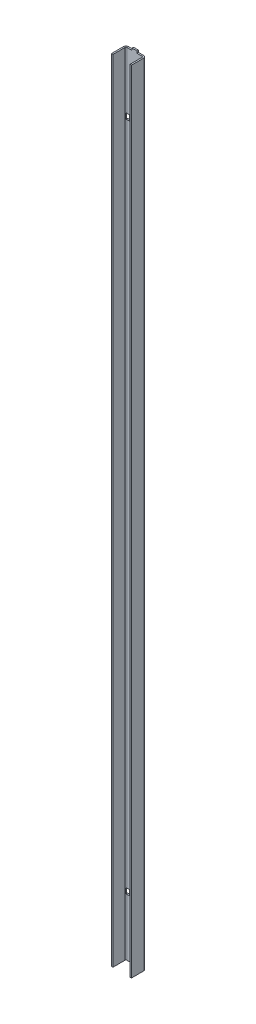
ISO-10303-21;
HEADER;
FILE_DESCRIPTION(('STEP AP214'),'2;1');
FILE_NAME('part.step','',(''),(''),'','','');
FILE_SCHEMA(('AUTOMOTIVE_DESIGN { 1 0 10303 214 1 1 1 1 }'));
ENDSEC;
DATA;
#1=APPLICATION_CONTEXT('core data for automotive mechanical design processes');
#2=APPLICATION_PROTOCOL_DEFINITION('international standard','automotive_design',2000,#1);
#3=PRODUCT_CONTEXT('',#1,'mechanical');
#4=PRODUCT('Part','Part','',(#3));
#5=PRODUCT_RELATED_PRODUCT_CATEGORY('part','',(#4));
#6=PRODUCT_DEFINITION_FORMATION('','',#4);
#7=PRODUCT_DEFINITION_CONTEXT('part definition',#1,'design');
#8=PRODUCT_DEFINITION('design','',#6,#7);
#9=PRODUCT_DEFINITION_SHAPE('','',#8);
#10=(LENGTH_UNIT() NAMED_UNIT(*) SI_UNIT(.MILLI.,.METRE.));
#11=(NAMED_UNIT(*) PLANE_ANGLE_UNIT() SI_UNIT($,.RADIAN.));
#12=(NAMED_UNIT(*) SI_UNIT($,.STERADIAN.) SOLID_ANGLE_UNIT());
#13=UNCERTAINTY_MEASURE_WITH_UNIT(LENGTH_MEASURE(1.E-05),#10,'distance_accuracy_value','');
#14=(GEOMETRIC_REPRESENTATION_CONTEXT(3) GLOBAL_UNCERTAINTY_ASSIGNED_CONTEXT((#13)) GLOBAL_UNIT_ASSIGNED_CONTEXT((#10,
#11,#12)) REPRESENTATION_CONTEXT('',''));
#15=CARTESIAN_POINT('',(0.,0.,0.));
#16=DIRECTION('',(0.,0.,1.));
#17=DIRECTION('',(1.,0.,0.));
#18=AXIS2_PLACEMENT_3D('',#15,#16,#17);
#19=CARTESIAN_POINT('',(1783.18296268255,394.,0.));
#20=DIRECTION('',(0.,0.,1.));
#21=DIRECTION('',(1.,0.,0.));
#22=AXIS2_PLACEMENT_3D('',#19,#20,#21);
#23=PLANE('',#22);
#24=DIRECTION('',(0.,1.,0.));
#25=VECTOR('',#24,1.);
#26=CARTESIAN_POINT('',(207.5,394.,0.));
#27=LINE('',#26,#25);
#28=CARTESIAN_POINT('',(207.5,-393.5,0.));
#29=VERTEX_POINT('',#28);
#30=CARTESIAN_POINT('',(207.5,393.5,0.));
#31=VERTEX_POINT('',#30);
#32=EDGE_CURVE('E114',#29,#31,#27,.T.);
#33=ORIENTED_EDGE('',*,*,#32,.F.);
#34=DIRECTION('',(-1.,0.,0.));
#35=VECTOR('',#34,1.);
#36=CARTESIAN_POINT('',(1783.18296268255,-393.5,0.));
#37=LINE('',#36,#35);
#38=CARTESIAN_POINT('',(209.,-393.5,0.));
#39=VERTEX_POINT('',#38);
#40=EDGE_CURVE('E625',#39,#29,#37,.T.);
#41=ORIENTED_EDGE('',*,*,#40,.F.);
#42=DIRECTION('',(0.,1.,0.));
#43=VECTOR('',#42,1.);
#44=CARTESIAN_POINT('',(209.,394.,0.));
#45=LINE('',#44,#43);
#46=CARTESIAN_POINT('',(209.,393.5,0.));
#47=VERTEX_POINT('',#46);
#48=EDGE_CURVE('E90',#39,#47,#45,.T.);
#49=ORIENTED_EDGE('',*,*,#48,.T.);
#50=DIRECTION('',(-1.,0.,0.));
#51=VECTOR('',#50,1.);
#52=CARTESIAN_POINT('',(1783.18296268255,393.5,0.));
#53=LINE('',#52,#51);
#54=EDGE_CURVE('E107',#47,#31,#53,.T.);
#55=ORIENTED_EDGE('',*,*,#54,.T.);
#56=EDGE_LOOP('',(#33,#41,#49,#55));
#57=FACE_BOUND('',#56,.T.);
#58=ADVANCED_FACE('F65',(#57),#23,.T.);
#59=CARTESIAN_POINT('',(1783.18296268255,393.5,-12.));
#60=DIRECTION('',(0.,-1.,0.));
#61=DIRECTION('',(-1.,0.,0.));
#62=AXIS2_PLACEMENT_3D('',#59,#60,#61);
#63=PLANE('',#62);
#64=DIRECTION('',(-1.,0.,0.));
#65=VECTOR('',#64,1.);
#66=CARTESIAN_POINT('',(1783.18296268255,393.5,-12.));
#67=LINE('',#66,#65);
#68=CARTESIAN_POINT('',(209.,393.5,-12.));
#69=VERTEX_POINT('',#68);
#70=CARTESIAN_POINT('',(207.5,393.5,-12.));
#71=VERTEX_POINT('',#70);
#72=EDGE_CURVE('E598',#69,#71,#67,.T.);
#73=ORIENTED_EDGE('',*,*,#72,.T.);
#74=DIRECTION('',(0.,0.,-1.));
#75=VECTOR('',#74,1.);
#76=CARTESIAN_POINT('',(207.5,393.5,-12.));
#77=LINE('',#76,#75);
#78=EDGE_CURVE('E600',#31,#71,#77,.T.);
#79=ORIENTED_EDGE('',*,*,#78,.F.);
#80=ORIENTED_EDGE('',*,*,#54,.F.);
#81=DIRECTION('',(0.,0.,-1.));
#82=VECTOR('',#81,1.);
#83=CARTESIAN_POINT('',(209.,393.5,-12.));
#84=LINE('',#83,#82);
#85=EDGE_CURVE('E13',#69,#47,#84,.F.);
#86=ORIENTED_EDGE('',*,*,#85,.F.);
#87=EDGE_LOOP('',(#73,#79,#80,#86));
#88=FACE_BOUND('',#87,.T.);
#89=ADVANCED_FACE('F597',(#88),#63,.F.);
#90=CARTESIAN_POINT('',(207.5,394.,-14.5));
#91=DIRECTION('',(1.,0.,0.));
#92=DIRECTION('',(0.,0.,1.));
#93=AXIS2_PLACEMENT_3D('',#90,#91,#92);
#94=PLANE('',#93);
#95=DIRECTION('',(0.,0.,1.));
#96=VECTOR('',#95,1.);
#97=CARTESIAN_POINT('',(207.5,-393.5,-12.));
#98=LINE('',#97,#96);
#99=CARTESIAN_POINT('',(207.5,-393.5,-12.));
#100=VERTEX_POINT('',#99);
#101=EDGE_CURVE('E605',#100,#29,#98,.T.);
#102=ORIENTED_EDGE('',*,*,#101,.T.);
#103=ORIENTED_EDGE('',*,*,#32,.T.);
#104=ORIENTED_EDGE('',*,*,#78,.T.);
#105=DIRECTION('',(0.,-1.,0.));
#106=VECTOR('',#105,1.);
#107=CARTESIAN_POINT('',(207.5,394.,-12.));
#108=LINE('',#107,#106);
#109=EDGE_CURVE('E619',#71,#100,#108,.T.);
#110=ORIENTED_EDGE('',*,*,#109,.T.);
#111=EDGE_LOOP('',(#102,#103,#104,#110));
#112=FACE_BOUND('',#111,.T.);
#113=ADVANCED_FACE('F621',(#112),#94,.F.);
#114=CARTESIAN_POINT('',(1783.18296268255,-393.5,-12.));
#115=DIRECTION('',(0.,1.,0.));
#116=DIRECTION('',(1.,0.,0.));
#117=AXIS2_PLACEMENT_3D('',#114,#115,#116);
#118=PLANE('',#117);
#119=ORIENTED_EDGE('',*,*,#40,.T.);
#120=ORIENTED_EDGE('',*,*,#101,.F.);
#121=DIRECTION('',(-1.,0.,0.));
#122=VECTOR('',#121,1.);
#123=CARTESIAN_POINT('',(1783.18296268255,-393.5,-12.));
#124=LINE('',#123,#122);
#125=CARTESIAN_POINT('',(209.,-393.5,-12.));
#126=VERTEX_POINT('',#125);
#127=EDGE_CURVE('E593',#126,#100,#124,.T.);
#128=ORIENTED_EDGE('',*,*,#127,.F.);
#129=DIRECTION('',(0.,0.,1.));
#130=VECTOR('',#129,1.);
#131=CARTESIAN_POINT('',(209.,-393.5,-12.));
#132=LINE('',#131,#130);
#133=EDGE_CURVE('E78',#39,#126,#132,.F.);
#134=ORIENTED_EDGE('',*,*,#133,.F.);
#135=EDGE_LOOP('',(#119,#120,#128,#134));
#136=FACE_BOUND('',#135,.T.);
#137=ADVANCED_FACE('F626',(#136),#118,.F.);
#138=CARTESIAN_POINT('',(209.,394.,-14.5));
#139=DIRECTION('',(1.,0.,0.));
#140=DIRECTION('',(0.,0.,1.));
#141=AXIS2_PLACEMENT_3D('',#138,#139,#140);
#142=PLANE('',#141);
#143=ORIENTED_EDGE('',*,*,#133,.T.);
#144=DIRECTION('',(0.,-1.,0.));
#145=VECTOR('',#144,1.);
#146=CARTESIAN_POINT('',(209.,394.,-12.));
#147=LINE('',#146,#145);
#148=EDGE_CURVE('E70',#69,#126,#147,.T.);
#149=ORIENTED_EDGE('',*,*,#148,.F.);
#150=ORIENTED_EDGE('',*,*,#85,.T.);
#151=ORIENTED_EDGE('',*,*,#48,.F.);
#152=EDGE_LOOP('',(#143,#149,#150,#151));
#153=FACE_BOUND('',#152,.T.);
#154=ADVANCED_FACE('F68',(#153),#142,.T.);
#155=CARTESIAN_POINT('',(-1348.18296268255,394.,0.));
#156=DIRECTION('',(0.,0.,1.));
#157=DIRECTION('',(1.,0.,0.));
#158=AXIS2_PLACEMENT_3D('',#155,#156,#157);
#159=PLANE('',#158);
#160=DIRECTION('',(0.,1.,0.));
#161=VECTOR('',#160,1.);
#162=CARTESIAN_POINT('',(227.5,394.,0.));
#163=LINE('',#162,#161);
#164=CARTESIAN_POINT('',(227.5,393.5,0.));
#165=VERTEX_POINT('',#164);
#166=CARTESIAN_POINT('',(227.5,-393.5,0.));
#167=VERTEX_POINT('',#166);
#168=EDGE_CURVE('E151',#165,#167,#163,.F.);
#169=ORIENTED_EDGE('',*,*,#168,.F.);
#170=DIRECTION('',(1.,0.,0.));
#171=VECTOR('',#170,1.);
#172=CARTESIAN_POINT('',(-1348.18296268255,393.5,0.));
#173=LINE('',#172,#171);
#174=CARTESIAN_POINT('',(226.,393.5,0.));
#175=VERTEX_POINT('',#174);
#176=EDGE_CURVE('E673',#175,#165,#173,.T.);
#177=ORIENTED_EDGE('',*,*,#176,.F.);
#178=DIRECTION('',(0.,1.,0.));
#179=VECTOR('',#178,1.);
#180=CARTESIAN_POINT('',(226.,394.,0.));
#181=LINE('',#180,#179);
#182=CARTESIAN_POINT('',(226.,-393.5,0.));
#183=VERTEX_POINT('',#182);
#184=EDGE_CURVE('E126',#175,#183,#181,.F.);
#185=ORIENTED_EDGE('',*,*,#184,.T.);
#186=DIRECTION('',(1.,0.,0.));
#187=VECTOR('',#186,1.);
#188=CARTESIAN_POINT('',(-1348.18296268255,-393.5,0.));
#189=LINE('',#188,#187);
#190=EDGE_CURVE('E655',#183,#167,#189,.T.);
#191=ORIENTED_EDGE('',*,*,#190,.T.);
#192=EDGE_LOOP('',(#169,#177,#185,#191));
#193=FACE_BOUND('',#192,.T.);
#194=ADVANCED_FACE('F942',(#193),#159,.T.);
#195=CARTESIAN_POINT('',(-1348.18296268255,-393.5,-12.));
#196=DIRECTION('',(0.,1.,0.));
#197=DIRECTION('',(-1.,0.,0.));
#198=AXIS2_PLACEMENT_3D('',#195,#196,#197);
#199=PLANE('',#198);
#200=DIRECTION('',(1.,0.,0.));
#201=VECTOR('',#200,1.);
#202=CARTESIAN_POINT('',(-1348.18296268255,-393.5,-12.));
#203=LINE('',#202,#201);
#204=CARTESIAN_POINT('',(226.,-393.5,-12.));
#205=VERTEX_POINT('',#204);
#206=CARTESIAN_POINT('',(227.5,-393.5,-12.));
#207=VERTEX_POINT('',#206);
#208=EDGE_CURVE('E658',#205,#207,#203,.T.);
#209=ORIENTED_EDGE('',*,*,#208,.T.);
#210=DIRECTION('',(0.,0.,1.));
#211=VECTOR('',#210,1.);
#212=CARTESIAN_POINT('',(227.5,-393.5,-12.));
#213=LINE('',#212,#211);
#214=EDGE_CURVE('E144',#167,#207,#213,.F.);
#215=ORIENTED_EDGE('',*,*,#214,.F.);
#216=ORIENTED_EDGE('',*,*,#190,.F.);
#217=DIRECTION('',(0.,0.,1.));
#218=VECTOR('',#217,1.);
#219=CARTESIAN_POINT('',(226.,-393.5,-12.));
#220=LINE('',#219,#218);
#221=EDGE_CURVE('E675',#205,#183,#220,.T.);
#222=ORIENTED_EDGE('',*,*,#221,.F.);
#223=EDGE_LOOP('',(#209,#215,#216,#222));
#224=FACE_BOUND('',#223,.T.);
#225=ADVANCED_FACE('F946',(#224),#199,.F.);
#226=CARTESIAN_POINT('',(227.5,394.,0.));
#227=DIRECTION('',(-1.,0.,0.));
#228=DIRECTION('',(0.,0.,-1.));
#229=AXIS2_PLACEMENT_3D('',#226,#227,#228);
#230=PLANE('',#229);
#231=ORIENTED_EDGE('',*,*,#214,.T.);
#232=DIRECTION('',(0.,-1.,0.));
#233=VECTOR('',#232,1.);
#234=CARTESIAN_POINT('',(227.5,394.,-12.));
#235=LINE('',#234,#233);
#236=CARTESIAN_POINT('',(227.5,393.5,-12.));
#237=VERTEX_POINT('',#236);
#238=EDGE_CURVE('E663',#207,#237,#235,.F.);
#239=ORIENTED_EDGE('',*,*,#238,.T.);
#240=DIRECTION('',(0.,0.,-1.));
#241=VECTOR('',#240,1.);
#242=CARTESIAN_POINT('',(227.5,393.5,-12.));
#243=LINE('',#242,#241);
#244=EDGE_CURVE('E667',#237,#165,#243,.F.);
#245=ORIENTED_EDGE('',*,*,#244,.T.);
#246=ORIENTED_EDGE('',*,*,#168,.T.);
#247=EDGE_LOOP('',(#231,#239,#245,#246));
#248=FACE_BOUND('',#247,.T.);
#249=ADVANCED_FACE('F951',(#248),#230,.F.);
#250=CARTESIAN_POINT('',(-1348.18296268255,393.5,-12.));
#251=DIRECTION('',(0.,-1.,0.));
#252=DIRECTION('',(1.,0.,0.));
#253=AXIS2_PLACEMENT_3D('',#250,#251,#252);
#254=PLANE('',#253);
#255=ORIENTED_EDGE('',*,*,#176,.T.);
#256=ORIENTED_EDGE('',*,*,#244,.F.);
#257=DIRECTION('',(1.,0.,0.));
#258=VECTOR('',#257,1.);
#259=CARTESIAN_POINT('',(-1348.18296268255,393.5,-12.));
#260=LINE('',#259,#258);
#261=CARTESIAN_POINT('',(226.,393.5,-12.));
#262=VERTEX_POINT('',#261);
#263=EDGE_CURVE('E648',#262,#237,#260,.T.);
#264=ORIENTED_EDGE('',*,*,#263,.F.);
#265=DIRECTION('',(0.,0.,-1.));
#266=VECTOR('',#265,1.);
#267=CARTESIAN_POINT('',(226.,393.5,-12.));
#268=LINE('',#267,#266);
#269=EDGE_CURVE('E594',#175,#262,#268,.T.);
#270=ORIENTED_EDGE('',*,*,#269,.F.);
#271=EDGE_LOOP('',(#255,#256,#264,#270));
#272=FACE_BOUND('',#271,.T.);
#273=ADVANCED_FACE('F958',(#272),#254,.F.);
#274=CARTESIAN_POINT('',(226.,394.,0.));
#275=DIRECTION('',(-1.,0.,0.));
#276=DIRECTION('',(0.,0.,-1.));
#277=AXIS2_PLACEMENT_3D('',#274,#275,#276);
#278=PLANE('',#277);
#279=ORIENTED_EDGE('',*,*,#221,.T.);
#280=ORIENTED_EDGE('',*,*,#184,.F.);
#281=ORIENTED_EDGE('',*,*,#269,.T.);
#282=DIRECTION('',(0.,-1.,0.));
#283=VECTOR('',#282,1.);
#284=CARTESIAN_POINT('',(226.,394.,-12.));
#285=LINE('',#284,#283);
#286=EDGE_CURVE('E645',#205,#262,#285,.F.);
#287=ORIENTED_EDGE('',*,*,#286,.F.);
#288=EDGE_LOOP('',(#279,#280,#281,#287));
#289=FACE_BOUND('',#288,.T.);
#290=ADVANCED_FACE('F933',(#289),#278,.T.);
#291=CARTESIAN_POINT('',(227.5,394.,-13.));
#292=DIRECTION('',(0.,0.,1.));
#293=DIRECTION('',(-1.,0.,0.));
#294=AXIS2_PLACEMENT_3D('',#291,#292,#293);
#295=PLANE('',#294);
#296=DIRECTION('',(0.,1.,0.));
#297=VECTOR('',#296,1.);
#298=CARTESIAN_POINT('',(210.,394.,-13.));
#299=LINE('',#298,#297);
#300=CARTESIAN_POINT('',(210.,-331.3,-13.));
#301=VERTEX_POINT('',#300);
#302=CARTESIAN_POINT('',(210.,331.3,-13.));
#303=VERTEX_POINT('',#302);
#304=EDGE_CURVE('E514',#301,#303,#299,.T.);
#305=ORIENTED_EDGE('',*,*,#304,.F.);
#306=DIRECTION('',(-1.,0.,0.));
#307=VECTOR('',#306,1.);
#308=CARTESIAN_POINT('',(227.5,-331.3,-13.));
#309=LINE('',#308,#307);
#310=CARTESIAN_POINT('',(212.5,-331.3,-13.));
#311=VERTEX_POINT('',#310);
#312=EDGE_CURVE('E519',#311,#301,#309,.T.);
#313=ORIENTED_EDGE('',*,*,#312,.F.);
#314=DIRECTION('',(0.,1.,0.));
#315=VECTOR('',#314,1.);
#316=CARTESIAN_POINT('',(212.5,394.,-13.));
#317=LINE('',#316,#315);
#318=CARTESIAN_POINT('',(212.5,-336.7,-13.));
#319=VERTEX_POINT('',#318);
#320=EDGE_CURVE('E872',#319,#311,#317,.T.);
#321=ORIENTED_EDGE('',*,*,#320,.F.);
#322=DIRECTION('',(1.,0.,0.));
#323=VECTOR('',#322,1.);
#324=CARTESIAN_POINT('',(227.5,-336.7,-13.));
#325=LINE('',#324,#323);
#326=CARTESIAN_POINT('',(210.,-336.7,-13.));
#327=VERTEX_POINT('',#326);
#328=EDGE_CURVE('E795',#327,#319,#325,.T.);
#329=ORIENTED_EDGE('',*,*,#328,.F.);
#330=CARTESIAN_POINT('',(210.,-393.5,-13.));
#331=VERTEX_POINT('',#330);
#332=EDGE_CURVE('E521',#331,#327,#299,.T.);
#333=ORIENTED_EDGE('',*,*,#332,.F.);
#334=DIRECTION('',(-1.,0.,0.));
#335=VECTOR('',#334,1.);
#336=CARTESIAN_POINT('',(227.5,-393.5,-13.));
#337=LINE('',#336,#335);
#338=CARTESIAN_POINT('',(215.,-393.5,-13.));
#339=VERTEX_POINT('',#338);
#340=EDGE_CURVE('E787',#339,#331,#337,.T.);
#341=ORIENTED_EDGE('',*,*,#340,.F.);
#342=DIRECTION('',(0.,-1.,0.));
#343=VECTOR('',#342,1.);
#344=CARTESIAN_POINT('',(215.,-393.5,-13.));
#345=LINE('',#344,#343);
#346=CARTESIAN_POINT('',(215.,-395.5,-13.));
#347=VERTEX_POINT('',#346);
#348=EDGE_CURVE('E793',#339,#347,#345,.T.);
#349=ORIENTED_EDGE('',*,*,#348,.T.);
#350=DIRECTION('',(1.,0.,0.));
#351=VECTOR('',#350,1.);
#352=CARTESIAN_POINT('',(215.,-395.5,-13.));
#353=LINE('',#352,#351);
#354=CARTESIAN_POINT('',(220.,-395.5,-13.));
#355=VERTEX_POINT('',#354);
#356=EDGE_CURVE('E804',#347,#355,#353,.T.);
#357=ORIENTED_EDGE('',*,*,#356,.T.);
#358=DIRECTION('',(0.,1.,0.));
#359=VECTOR('',#358,1.);
#360=CARTESIAN_POINT('',(220.,-393.5,-13.));
#361=LINE('',#360,#359);
#362=CARTESIAN_POINT('',(220.,-393.5,-13.));
#363=VERTEX_POINT('',#362);
#364=EDGE_CURVE('E807',#355,#363,#361,.T.);
#365=ORIENTED_EDGE('',*,*,#364,.T.);
#366=CARTESIAN_POINT('',(225.,-393.5,-13.));
#367=VERTEX_POINT('',#366);
#368=EDGE_CURVE('E794',#367,#363,#337,.T.);
#369=ORIENTED_EDGE('',*,*,#368,.F.);
#370=DIRECTION('',(0.,1.,0.));
#371=VECTOR('',#370,1.);
#372=CARTESIAN_POINT('',(225.,394.,-13.));
#373=LINE('',#372,#371);
#374=CARTESIAN_POINT('',(225.,393.5,-13.));
#375=VERTEX_POINT('',#374);
#376=EDGE_CURVE('E810',#375,#367,#373,.F.);
#377=ORIENTED_EDGE('',*,*,#376,.F.);
#378=DIRECTION('',(-1.,0.,0.));
#379=VECTOR('',#378,1.);
#380=CARTESIAN_POINT('',(227.5,393.5,-13.));
#381=LINE('',#380,#379);
#382=CARTESIAN_POINT('',(220.,393.5,-13.));
#383=VERTEX_POINT('',#382);
#384=EDGE_CURVE('E780',#383,#375,#381,.F.);
#385=ORIENTED_EDGE('',*,*,#384,.F.);
#386=DIRECTION('',(0.,1.,0.));
#387=VECTOR('',#386,1.);
#388=CARTESIAN_POINT('',(220.,393.5,-13.));
#389=LINE('',#388,#387);
#390=CARTESIAN_POINT('',(220.,395.5,-13.));
#391=VERTEX_POINT('',#390);
#392=EDGE_CURVE('E776',#383,#391,#389,.T.);
#393=ORIENTED_EDGE('',*,*,#392,.T.);
#394=DIRECTION('',(-1.,0.,0.));
#395=VECTOR('',#394,1.);
#396=CARTESIAN_POINT('',(220.,395.5,-13.));
#397=LINE('',#396,#395);
#398=CARTESIAN_POINT('',(215.,395.5,-13.));
#399=VERTEX_POINT('',#398);
#400=EDGE_CURVE('E772',#391,#399,#397,.T.);
#401=ORIENTED_EDGE('',*,*,#400,.T.);
#402=DIRECTION('',(0.,-1.,0.));
#403=VECTOR('',#402,1.);
#404=CARTESIAN_POINT('',(215.,393.5,-13.));
#405=LINE('',#404,#403);
#406=CARTESIAN_POINT('',(215.,393.5,-13.));
#407=VERTEX_POINT('',#406);
#408=EDGE_CURVE('E768',#399,#407,#405,.T.);
#409=ORIENTED_EDGE('',*,*,#408,.T.);
#410=CARTESIAN_POINT('',(210.,393.5,-13.));
#411=VERTEX_POINT('',#410);
#412=EDGE_CURVE('E771',#411,#407,#381,.F.);
#413=ORIENTED_EDGE('',*,*,#412,.F.);
#414=CARTESIAN_POINT('',(210.,336.7,-13.));
#415=VERTEX_POINT('',#414);
#416=EDGE_CURVE('E520',#415,#411,#299,.T.);
#417=ORIENTED_EDGE('',*,*,#416,.F.);
#418=DIRECTION('',(-1.,0.,0.));
#419=VECTOR('',#418,1.);
#420=CARTESIAN_POINT('',(227.5,336.7,-13.));
#421=LINE('',#420,#419);
#422=CARTESIAN_POINT('',(212.5,336.7,-13.));
#423=VERTEX_POINT('',#422);
#424=EDGE_CURVE('E760',#423,#415,#421,.T.);
#425=ORIENTED_EDGE('',*,*,#424,.F.);
#426=DIRECTION('',(0.,1.,0.));
#427=VECTOR('',#426,1.);
#428=CARTESIAN_POINT('',(212.5,394.,-13.));
#429=LINE('',#428,#427);
#430=CARTESIAN_POINT('',(212.5,331.3,-12.9999999999999));
#431=VERTEX_POINT('',#430);
#432=EDGE_CURVE('E755',#431,#423,#429,.T.);
#433=ORIENTED_EDGE('',*,*,#432,.F.);
#434=DIRECTION('',(1.,0.,0.));
#435=VECTOR('',#434,1.);
#436=CARTESIAN_POINT('',(227.5,331.3,-13.));
#437=LINE('',#436,#435);
#438=EDGE_CURVE('E750',#303,#431,#437,.T.);
#439=ORIENTED_EDGE('',*,*,#438,.F.);
#440=EDGE_LOOP('',(#305,#313,#321,#329,#333,#341,#349,#357,#365,#369,#377,#385,#393,#401,#409,
#413,#417,#425,#433,#439));
#441=FACE_BOUND('',#440,.T.);
#442=ADVANCED_FACE('F868',(#441),#295,.T.);
#443=CARTESIAN_POINT('',(227.5,-331.3,1569.28442449517));
#444=DIRECTION('',(0.,-1.,0.));
#445=DIRECTION('',(0.,0.,-1.));
#446=AXIS2_PLACEMENT_3D('',#443,#444,#445);
#447=PLANE('',#446);
#448=DIRECTION('',(-1.,0.,0.));
#449=VECTOR('',#448,1.);
#450=CARTESIAN_POINT('',(227.5,-331.3,-14.5));
#451=LINE('',#450,#449);
#452=CARTESIAN_POINT('',(212.5,-331.3,-14.5));
#453=VERTEX_POINT('',#452);
#454=CARTESIAN_POINT('',(210.,-331.3,-14.5));
#455=VERTEX_POINT('',#454);
#456=EDGE_CURVE('E162',#453,#455,#451,.T.);
#457=ORIENTED_EDGE('',*,*,#456,.F.);
#458=DIRECTION('',(0.,0.,-1.));
#459=VECTOR('',#458,1.);
#460=CARTESIAN_POINT('',(212.5,-331.3,1569.28442449517));
#461=LINE('',#460,#459);
#462=EDGE_CURVE('E684',#311,#453,#461,.T.);
#463=ORIENTED_EDGE('',*,*,#462,.F.);
#464=ORIENTED_EDGE('',*,*,#312,.T.);
#465=DIRECTION('',(0.,0.,-1.));
#466=VECTOR('',#465,1.);
#467=CARTESIAN_POINT('',(210.,-331.3,1569.28442449517));
#468=LINE('',#467,#466);
#469=EDGE_CURVE('E649',#301,#455,#468,.T.);
#470=ORIENTED_EDGE('',*,*,#469,.T.);
#471=EDGE_LOOP('',(#457,#463,#464,#470));
#472=FACE_BOUND('',#471,.T.);
#473=ADVANCED_FACE('F870',(#472),#447,.T.);
#474=CARTESIAN_POINT('',(212.5,394.,1569.28442449517));
#475=DIRECTION('',(-1.,0.,0.));
#476=DIRECTION('',(0.,0.,1.));
#477=AXIS2_PLACEMENT_3D('',#474,#475,#476);
#478=PLANE('',#477);
#479=DIRECTION('',(0.,1.,0.));
#480=VECTOR('',#479,1.);
#481=CARTESIAN_POINT('',(212.5,394.,-14.5));
#482=LINE('',#481,#480);
#483=CARTESIAN_POINT('',(212.5,-336.7,-14.5));
#484=VERTEX_POINT('',#483);
#485=EDGE_CURVE('E171',#484,#453,#482,.T.);
#486=ORIENTED_EDGE('',*,*,#485,.F.);
#487=DIRECTION('',(0.,0.,-1.));
#488=VECTOR('',#487,1.);
#489=CARTESIAN_POINT('',(212.5,-336.7,1569.28442449517));
#490=LINE('',#489,#488);
#491=EDGE_CURVE('E687',#319,#484,#490,.T.);
#492=ORIENTED_EDGE('',*,*,#491,.F.);
#493=ORIENTED_EDGE('',*,*,#320,.T.);
#494=ORIENTED_EDGE('',*,*,#462,.T.);
#495=EDGE_LOOP('',(#486,#492,#493,#494));
#496=FACE_BOUND('',#495,.T.);
#497=ADVANCED_FACE('F1226',(#496),#478,.T.);
#498=CARTESIAN_POINT('',(227.5,-336.7,1569.28442449517));
#499=DIRECTION('',(0.,1.,0.));
#500=DIRECTION('',(0.,0.,1.));
#501=AXIS2_PLACEMENT_3D('',#498,#499,#500);
#502=PLANE('',#501);
#503=DIRECTION('',(1.,0.,0.));
#504=VECTOR('',#503,1.);
#505=CARTESIAN_POINT('',(227.5,-336.7,-14.5));
#506=LINE('',#505,#504);
#507=CARTESIAN_POINT('',(210.,-336.7,-14.5));
#508=VERTEX_POINT('',#507);
#509=EDGE_CURVE('E501',#508,#484,#506,.T.);
#510=ORIENTED_EDGE('',*,*,#509,.F.);
#511=DIRECTION('',(0.,0.,-1.));
#512=VECTOR('',#511,1.);
#513=CARTESIAN_POINT('',(210.,-336.7,1569.28442449517));
#514=LINE('',#513,#512);
#515=EDGE_CURVE('E690',#327,#508,#514,.T.);
#516=ORIENTED_EDGE('',*,*,#515,.F.);
#517=ORIENTED_EDGE('',*,*,#328,.T.);
#518=ORIENTED_EDGE('',*,*,#491,.T.);
#519=EDGE_LOOP('',(#510,#516,#517,#518));
#520=FACE_BOUND('',#519,.T.);
#521=ADVANCED_FACE('F1234',(#520),#502,.T.);
#522=CARTESIAN_POINT('',(227.5,-393.5,1569.28442449517));
#523=DIRECTION('',(0.,-1.,0.));
#524=DIRECTION('',(0.,0.,-1.));
#525=AXIS2_PLACEMENT_3D('',#522,#523,#524);
#526=PLANE('',#525);
#527=DIRECTION('',(1.,0.,0.));
#528=VECTOR('',#527,1.);
#529=CARTESIAN_POINT('',(226.,-393.5,-14.5));
#530=LINE('',#529,#528);
#531=CARTESIAN_POINT('',(215.,-393.5,-14.5));
#532=VERTEX_POINT('',#531);
#533=CARTESIAN_POINT('',(210.,-393.5,-14.5));
#534=VERTEX_POINT('',#533);
#535=EDGE_CURVE('E500',#532,#534,#530,.F.);
#536=ORIENTED_EDGE('',*,*,#535,.F.);
#537=DIRECTION('',(0.,0.,-1.));
#538=VECTOR('',#537,1.);
#539=CARTESIAN_POINT('',(215.,-393.5,1569.28442449517));
#540=LINE('',#539,#538);
#541=EDGE_CURVE('E697',#339,#532,#540,.T.);
#542=ORIENTED_EDGE('',*,*,#541,.F.);
#543=ORIENTED_EDGE('',*,*,#340,.T.);
#544=DIRECTION('',(0.,0.,-1.));
#545=VECTOR('',#544,1.);
#546=CARTESIAN_POINT('',(210.,-393.5,1569.28442449517));
#547=LINE('',#546,#545);
#548=EDGE_CURVE('E693',#331,#534,#547,.T.);
#549=ORIENTED_EDGE('',*,*,#548,.T.);
#550=EDGE_LOOP('',(#536,#542,#543,#549));
#551=FACE_BOUND('',#550,.T.);
#552=ADVANCED_FACE('F1013',(#551),#526,.T.);
#553=CARTESIAN_POINT('',(215.,-393.5,1569.28442449517));
#554=DIRECTION('',(1.,0.,0.));
#555=DIRECTION('',(0.,0.,-1.));
#556=AXIS2_PLACEMENT_3D('',#553,#554,#555);
#557=PLANE('',#556);
#558=ORIENTED_EDGE('',*,*,#541,.T.);
#559=DIRECTION('',(0.,-1.,0.));
#560=VECTOR('',#559,1.);
#561=CARTESIAN_POINT('',(215.,-393.5,-14.5));
#562=LINE('',#561,#560);
#563=CARTESIAN_POINT('',(215.,-395.5,-14.5));
#564=VERTEX_POINT('',#563);
#565=EDGE_CURVE('E496',#532,#564,#562,.T.);
#566=ORIENTED_EDGE('',*,*,#565,.T.);
#567=DIRECTION('',(0.,0.,-1.));
#568=VECTOR('',#567,1.);
#569=CARTESIAN_POINT('',(215.,-395.5,1569.28442449517));
#570=LINE('',#569,#568);
#571=EDGE_CURVE('E701',#347,#564,#570,.T.);
#572=ORIENTED_EDGE('',*,*,#571,.F.);
#573=ORIENTED_EDGE('',*,*,#348,.F.);
#574=EDGE_LOOP('',(#558,#566,#572,#573));
#575=FACE_BOUND('',#574,.T.);
#576=ADVANCED_FACE('F1250',(#575),#557,.F.);
#577=CARTESIAN_POINT('',(215.,-395.5,1569.28442449517));
#578=DIRECTION('',(0.,1.,0.));
#579=DIRECTION('',(0.,0.,1.));
#580=AXIS2_PLACEMENT_3D('',#577,#578,#579);
#581=PLANE('',#580);
#582=ORIENTED_EDGE('',*,*,#571,.T.);
#583=DIRECTION('',(1.,0.,0.));
#584=VECTOR('',#583,1.);
#585=CARTESIAN_POINT('',(215.,-395.5,-14.5));
#586=LINE('',#585,#584);
#587=CARTESIAN_POINT('',(220.,-395.5,-14.5));
#588=VERTEX_POINT('',#587);
#589=EDGE_CURVE('E490',#564,#588,#586,.T.);
#590=ORIENTED_EDGE('',*,*,#589,.T.);
#591=DIRECTION('',(0.,0.,-1.));
#592=VECTOR('',#591,1.);
#593=CARTESIAN_POINT('',(220.,-395.5,1569.28442449517));
#594=LINE('',#593,#592);
#595=EDGE_CURVE('E705',#355,#588,#594,.T.);
#596=ORIENTED_EDGE('',*,*,#595,.F.);
#597=ORIENTED_EDGE('',*,*,#356,.F.);
#598=EDGE_LOOP('',(#582,#590,#596,#597));
#599=FACE_BOUND('',#598,.T.);
#600=ADVANCED_FACE('F1259',(#599),#581,.F.);
#601=CARTESIAN_POINT('',(220.,-393.5,1569.28442449517));
#602=DIRECTION('',(-1.,0.,0.));
#603=DIRECTION('',(0.,0.,1.));
#604=AXIS2_PLACEMENT_3D('',#601,#602,#603);
#605=PLANE('',#604);
#606=ORIENTED_EDGE('',*,*,#595,.T.);
#607=DIRECTION('',(0.,1.,0.));
#608=VECTOR('',#607,1.);
#609=CARTESIAN_POINT('',(220.,-393.5,-14.5));
#610=LINE('',#609,#608);
#611=CARTESIAN_POINT('',(220.,-393.5,-14.5));
#612=VERTEX_POINT('',#611);
#613=EDGE_CURVE('E486',#588,#612,#610,.T.);
#614=ORIENTED_EDGE('',*,*,#613,.T.);
#615=DIRECTION('',(0.,0.,-1.));
#616=VECTOR('',#615,1.);
#617=CARTESIAN_POINT('',(220.,-393.5,1569.28442449517));
#618=LINE('',#617,#616);
#619=EDGE_CURVE('E709',#363,#612,#618,.T.);
#620=ORIENTED_EDGE('',*,*,#619,.F.);
#621=ORIENTED_EDGE('',*,*,#364,.F.);
#622=EDGE_LOOP('',(#606,#614,#620,#621));
#623=FACE_BOUND('',#622,.T.);
#624=ADVANCED_FACE('F831',(#623),#605,.F.);
#625=CARTESIAN_POINT('',(225.,-393.5,-14.5));
#626=VERTEX_POINT('',#625);
#627=EDGE_CURVE('E491',#626,#612,#530,.F.);
#628=ORIENTED_EDGE('',*,*,#627,.F.);
#629=DIRECTION('',(0.,0.,-1.));
#630=VECTOR('',#629,1.);
#631=CARTESIAN_POINT('',(225.,-393.5,1569.28442449517));
#632=LINE('',#631,#630);
#633=EDGE_CURVE('E713',#367,#626,#632,.T.);
#634=ORIENTED_EDGE('',*,*,#633,.F.);
#635=ORIENTED_EDGE('',*,*,#368,.T.);
#636=ORIENTED_EDGE('',*,*,#619,.T.);
#637=EDGE_LOOP('',(#628,#634,#635,#636));
#638=FACE_BOUND('',#637,.T.);
#639=ADVANCED_FACE('F826',(#638),#526,.T.);
#640=CARTESIAN_POINT('',(227.5,393.5,1569.28442449517));
#641=DIRECTION('',(0.,1.,0.));
#642=DIRECTION('',(0.,0.,1.));
#643=AXIS2_PLACEMENT_3D('',#640,#641,#642);
#644=PLANE('',#643);
#645=DIRECTION('',(1.,0.,0.));
#646=VECTOR('',#645,1.);
#647=CARTESIAN_POINT('',(209.,393.5,-14.5));
#648=LINE('',#647,#646);
#649=CARTESIAN_POINT('',(220.,393.5,-14.5));
#650=VERTEX_POINT('',#649);
#651=CARTESIAN_POINT('',(225.,393.5,-14.5));
#652=VERTEX_POINT('',#651);
#653=EDGE_CURVE('E473',#650,#652,#648,.T.);
#654=ORIENTED_EDGE('',*,*,#653,.F.);
#655=DIRECTION('',(0.,0.,-1.));
#656=VECTOR('',#655,1.);
#657=CARTESIAN_POINT('',(220.,393.5,1569.28442449517));
#658=LINE('',#657,#656);
#659=EDGE_CURVE('E720',#383,#650,#658,.T.);
#660=ORIENTED_EDGE('',*,*,#659,.F.);
#661=ORIENTED_EDGE('',*,*,#384,.T.);
#662=DIRECTION('',(0.,0.,-1.));
#663=VECTOR('',#662,1.);
#664=CARTESIAN_POINT('',(225.,393.5,1569.28442449517));
#665=LINE('',#664,#663);
#666=EDGE_CURVE('E716',#375,#652,#665,.T.);
#667=ORIENTED_EDGE('',*,*,#666,.T.);
#668=EDGE_LOOP('',(#654,#660,#661,#667));
#669=FACE_BOUND('',#668,.T.);
#670=ADVANCED_FACE('F912',(#669),#644,.T.);
#671=CARTESIAN_POINT('',(220.,393.5,1569.28442449517));
#672=DIRECTION('',(-1.,0.,0.));
#673=DIRECTION('',(0.,0.,1.));
#674=AXIS2_PLACEMENT_3D('',#671,#672,#673);
#675=PLANE('',#674);
#676=ORIENTED_EDGE('',*,*,#659,.T.);
#677=DIRECTION('',(0.,1.,0.));
#678=VECTOR('',#677,1.);
#679=CARTESIAN_POINT('',(220.,393.5,-14.5));
#680=LINE('',#679,#678);
#681=CARTESIAN_POINT('',(220.,395.5,-14.5));
#682=VERTEX_POINT('',#681);
#683=EDGE_CURVE('E901',#650,#682,#680,.T.);
#684=ORIENTED_EDGE('',*,*,#683,.T.);
#685=DIRECTION('',(0.,0.,-1.));
#686=VECTOR('',#685,1.);
#687=CARTESIAN_POINT('',(220.,395.5,1569.28442449517));
#688=LINE('',#687,#686);
#689=EDGE_CURVE('E724',#391,#682,#688,.T.);
#690=ORIENTED_EDGE('',*,*,#689,.F.);
#691=ORIENTED_EDGE('',*,*,#392,.F.);
#692=EDGE_LOOP('',(#676,#684,#690,#691));
#693=FACE_BOUND('',#692,.T.);
#694=ADVANCED_FACE('F914',(#693),#675,.F.);
#695=CARTESIAN_POINT('',(220.,395.5,1569.28442449517));
#696=DIRECTION('',(0.,-1.,0.));
#697=DIRECTION('',(0.,0.,-1.));
#698=AXIS2_PLACEMENT_3D('',#695,#696,#697);
#699=PLANE('',#698);
#700=ORIENTED_EDGE('',*,*,#689,.T.);
#701=DIRECTION('',(-1.,0.,0.));
#702=VECTOR('',#701,1.);
#703=CARTESIAN_POINT('',(220.,395.5,-14.5));
#704=LINE('',#703,#702);
#705=CARTESIAN_POINT('',(215.,395.5,-14.5));
#706=VERTEX_POINT('',#705);
#707=EDGE_CURVE('E898',#682,#706,#704,.T.);
#708=ORIENTED_EDGE('',*,*,#707,.T.);
#709=DIRECTION('',(0.,0.,-1.));
#710=VECTOR('',#709,1.);
#711=CARTESIAN_POINT('',(215.,395.5,1569.28442449517));
#712=LINE('',#711,#710);
#713=EDGE_CURVE('E728',#399,#706,#712,.T.);
#714=ORIENTED_EDGE('',*,*,#713,.F.);
#715=ORIENTED_EDGE('',*,*,#400,.F.);
#716=EDGE_LOOP('',(#700,#708,#714,#715));
#717=FACE_BOUND('',#716,.T.);
#718=ADVANCED_FACE('F916',(#717),#699,.F.);
#719=CARTESIAN_POINT('',(215.,393.5,1569.28442449517));
#720=DIRECTION('',(1.,0.,0.));
#721=DIRECTION('',(0.,0.,-1.));
#722=AXIS2_PLACEMENT_3D('',#719,#720,#721);
#723=PLANE('',#722);
#724=ORIENTED_EDGE('',*,*,#713,.T.);
#725=DIRECTION('',(0.,-1.,0.));
#726=VECTOR('',#725,1.);
#727=CARTESIAN_POINT('',(215.,393.5,-14.5));
#728=LINE('',#727,#726);
#729=CARTESIAN_POINT('',(215.,393.5,-14.5));
#730=VERTEX_POINT('',#729);
#731=EDGE_CURVE('E472',#706,#730,#728,.T.);
#732=ORIENTED_EDGE('',*,*,#731,.T.);
#733=DIRECTION('',(0.,0.,-1.));
#734=VECTOR('',#733,1.);
#735=CARTESIAN_POINT('',(215.,393.5,1569.28442449517));
#736=LINE('',#735,#734);
#737=EDGE_CURVE('E732',#407,#730,#736,.T.);
#738=ORIENTED_EDGE('',*,*,#737,.F.);
#739=ORIENTED_EDGE('',*,*,#408,.F.);
#740=EDGE_LOOP('',(#724,#732,#738,#739));
#741=FACE_BOUND('',#740,.T.);
#742=ADVANCED_FACE('F893',(#741),#723,.F.);
#743=CARTESIAN_POINT('',(210.,393.5,-14.5));
#744=VERTEX_POINT('',#743);
#745=EDGE_CURVE('E465',#744,#730,#648,.T.);
#746=ORIENTED_EDGE('',*,*,#745,.F.);
#747=DIRECTION('',(0.,0.,-1.));
#748=VECTOR('',#747,1.);
#749=CARTESIAN_POINT('',(210.,393.5,1569.28442449517));
#750=LINE('',#749,#748);
#751=EDGE_CURVE('E736',#411,#744,#750,.T.);
#752=ORIENTED_EDGE('',*,*,#751,.F.);
#753=ORIENTED_EDGE('',*,*,#412,.T.);
#754=ORIENTED_EDGE('',*,*,#737,.T.);
#755=EDGE_LOOP('',(#746,#752,#753,#754));
#756=FACE_BOUND('',#755,.T.);
#757=ADVANCED_FACE('F890',(#756),#644,.T.);
#758=CARTESIAN_POINT('',(227.5,336.7,1569.28442449517));
#759=DIRECTION('',(0.,-1.,0.));
#760=DIRECTION('',(0.,0.,-1.));
#761=AXIS2_PLACEMENT_3D('',#758,#759,#760);
#762=PLANE('',#761);
#763=DIRECTION('',(-1.,0.,0.));
#764=VECTOR('',#763,1.);
#765=CARTESIAN_POINT('',(227.5,336.7,-14.5));
#766=LINE('',#765,#764);
#767=CARTESIAN_POINT('',(212.5,336.7,-14.5));
#768=VERTEX_POINT('',#767);
#769=CARTESIAN_POINT('',(210.,336.7,-14.5));
#770=VERTEX_POINT('',#769);
#771=EDGE_CURVE('E458',#768,#770,#766,.T.);
#772=ORIENTED_EDGE('',*,*,#771,.F.);
#773=DIRECTION('',(0.,0.,-1.));
#774=VECTOR('',#773,1.);
#775=CARTESIAN_POINT('',(212.5,336.7,1569.28442449517));
#776=LINE('',#775,#774);
#777=EDGE_CURVE('E742',#423,#768,#776,.T.);
#778=ORIENTED_EDGE('',*,*,#777,.F.);
#779=ORIENTED_EDGE('',*,*,#424,.T.);
#780=DIRECTION('',(0.,0.,-1.));
#781=VECTOR('',#780,1.);
#782=CARTESIAN_POINT('',(210.,336.7,1569.28442449517));
#783=LINE('',#782,#781);
#784=EDGE_CURVE('E739',#415,#770,#783,.T.);
#785=ORIENTED_EDGE('',*,*,#784,.T.);
#786=EDGE_LOOP('',(#772,#778,#779,#785));
#787=FACE_BOUND('',#786,.T.);
#788=ADVANCED_FACE('F992',(#787),#762,.T.);
#789=CARTESIAN_POINT('',(212.5,394.,1569.28442449517));
#790=DIRECTION('',(-1.,0.,0.));
#791=DIRECTION('',(0.,0.,1.));
#792=AXIS2_PLACEMENT_3D('',#789,#790,#791);
#793=PLANE('',#792);
#794=DIRECTION('',(0.,1.,0.));
#795=VECTOR('',#794,1.);
#796=CARTESIAN_POINT('',(212.5,394.,-14.5));
#797=LINE('',#796,#795);
#798=CARTESIAN_POINT('',(212.5,331.3,-14.5));
#799=VERTEX_POINT('',#798);
#800=EDGE_CURVE('E446',#799,#768,#797,.T.);
#801=ORIENTED_EDGE('',*,*,#800,.F.);
#802=DIRECTION('',(0.,0.,-1.));
#803=VECTOR('',#802,1.);
#804=CARTESIAN_POINT('',(212.5,331.3,1569.28442449517));
#805=LINE('',#804,#803);
#806=EDGE_CURVE('E746',#431,#799,#805,.T.);
#807=ORIENTED_EDGE('',*,*,#806,.F.);
#808=ORIENTED_EDGE('',*,*,#432,.T.);
#809=ORIENTED_EDGE('',*,*,#777,.T.);
#810=EDGE_LOOP('',(#801,#807,#808,#809));
#811=FACE_BOUND('',#810,.T.);
#812=ADVANCED_FACE('F989',(#811),#793,.T.);
#813=CARTESIAN_POINT('',(227.5,331.3,1569.28442449517));
#814=DIRECTION('',(0.,1.,0.));
#815=DIRECTION('',(0.,0.,1.));
#816=AXIS2_PLACEMENT_3D('',#813,#814,#815);
#817=PLANE('',#816);
#818=DIRECTION('',(1.,0.,0.));
#819=VECTOR('',#818,1.);
#820=CARTESIAN_POINT('',(227.5,331.3,-14.5));
#821=LINE('',#820,#819);
#822=CARTESIAN_POINT('',(210.,331.3,-14.5));
#823=VERTEX_POINT('',#822);
#824=EDGE_CURVE('E441',#823,#799,#821,.T.);
#825=ORIENTED_EDGE('',*,*,#824,.F.);
#826=DIRECTION('',(0.,0.,-1.));
#827=VECTOR('',#826,1.);
#828=CARTESIAN_POINT('',(210.,331.3,1569.28442449517));
#829=LINE('',#828,#827);
#830=EDGE_CURVE('E403',#303,#823,#829,.T.);
#831=ORIENTED_EDGE('',*,*,#830,.F.);
#832=ORIENTED_EDGE('',*,*,#438,.T.);
#833=ORIENTED_EDGE('',*,*,#806,.T.);
#834=EDGE_LOOP('',(#825,#831,#832,#833));
#835=FACE_BOUND('',#834,.T.);
#836=ADVANCED_FACE('F994',(#835),#817,.T.);
#837=CARTESIAN_POINT('',(227.5,394.,-14.5));
#838=DIRECTION('',(0.,0.,1.));
#839=DIRECTION('',(-1.,0.,0.));
#840=AXIS2_PLACEMENT_3D('',#837,#838,#839);
#841=PLANE('',#840);
#842=ORIENTED_EDGE('',*,*,#824,.T.);
#843=ORIENTED_EDGE('',*,*,#800,.T.);
#844=ORIENTED_EDGE('',*,*,#771,.T.);
#845=DIRECTION('',(0.,-1.,0.));
#846=VECTOR('',#845,1.);
#847=CARTESIAN_POINT('',(210.,394.,-14.5));
#848=LINE('',#847,#846);
#849=EDGE_CURVE('E463',#770,#744,#848,.F.);
#850=ORIENTED_EDGE('',*,*,#849,.T.);
#851=ORIENTED_EDGE('',*,*,#745,.T.);
#852=ORIENTED_EDGE('',*,*,#731,.F.);
#853=ORIENTED_EDGE('',*,*,#707,.F.);
#854=ORIENTED_EDGE('',*,*,#683,.F.);
#855=ORIENTED_EDGE('',*,*,#653,.T.);
#856=DIRECTION('',(0.,1.,0.));
#857=VECTOR('',#856,1.);
#858=CARTESIAN_POINT('',(225.,394.,-14.5));
#859=LINE('',#858,#857);
#860=EDGE_CURVE('E840',#652,#626,#859,.F.);
#861=ORIENTED_EDGE('',*,*,#860,.T.);
#862=ORIENTED_EDGE('',*,*,#627,.T.);
#863=ORIENTED_EDGE('',*,*,#613,.F.);
#864=ORIENTED_EDGE('',*,*,#589,.F.);
#865=ORIENTED_EDGE('',*,*,#565,.F.);
#866=ORIENTED_EDGE('',*,*,#535,.T.);
#867=EDGE_CURVE('E467',#534,#508,#848,.F.);
#868=ORIENTED_EDGE('',*,*,#867,.T.);
#869=ORIENTED_EDGE('',*,*,#509,.T.);
#870=ORIENTED_EDGE('',*,*,#485,.T.);
#871=ORIENTED_EDGE('',*,*,#456,.T.);
#872=EDGE_CURVE('E466',#455,#823,#848,.F.);
#873=ORIENTED_EDGE('',*,*,#872,.T.);
#874=EDGE_LOOP('',(#842,#843,#844,#850,#851,#852,#853,#854,#855,#861,#862,#863,#864,#865,#866,
#868,#869,#870,#871,#873));
#875=FACE_BOUND('',#874,.T.);
#876=ADVANCED_FACE('F836',(#875),#841,.F.);
#877=CARTESIAN_POINT('',(225.,-393.5,-12.));
#878=DIRECTION('',(0.,-1.,0.));
#879=DIRECTION('',(1.,0.,0.));
#880=AXIS2_PLACEMENT_3D('',#877,#878,#879);
#881=PLANE('',#880);
#882=ORIENTED_EDGE('',*,*,#208,.F.);
#883=CARTESIAN_POINT('',(225.,-393.5,-12.));
#884=DIRECTION('',(0.,1.,0.));
#885=DIRECTION('',(0.,0.,1.));
#886=AXIS2_PLACEMENT_3D('',#883,#884,#885);
#887=CIRCLE('',#886,1.00000000000001);
#888=EDGE_CURVE('E428',#205,#367,#887,.T.);
#889=ORIENTED_EDGE('',*,*,#888,.T.);
#890=ORIENTED_EDGE('',*,*,#633,.T.);
#891=CARTESIAN_POINT('',(225.,-393.5,-12.));
#892=DIRECTION('',(0.,1.,0.));
#893=DIRECTION('',(0.,0.,1.));
#894=AXIS2_PLACEMENT_3D('',#891,#892,#893);
#895=CIRCLE('',#894,2.5);
#896=EDGE_CURVE('E440',#207,#626,#895,.T.);
#897=ORIENTED_EDGE('',*,*,#896,.F.);
#898=EDGE_LOOP('',(#882,#889,#890,#897));
#899=FACE_BOUND('',#898,.T.);
#900=ADVANCED_FACE('F973',(#899),#881,.T.);
#901=CARTESIAN_POINT('',(225.,393.5,-12.));
#902=DIRECTION('',(0.,1.,0.));
#903=DIRECTION('',(0.,0.,1.));
#904=AXIS2_PLACEMENT_3D('',#901,#902,#903);
#905=PLANE('',#904);
#906=CARTESIAN_POINT('',(225.,393.5,-12.));
#907=DIRECTION('',(0.,1.,0.));
#908=DIRECTION('',(0.,0.,1.));
#909=AXIS2_PLACEMENT_3D('',#906,#907,#908);
#910=CIRCLE('',#909,1.00000000000001);
#911=EDGE_CURVE('E433',#375,#262,#910,.F.);
#912=ORIENTED_EDGE('',*,*,#911,.T.);
#913=ORIENTED_EDGE('',*,*,#263,.T.);
#914=CARTESIAN_POINT('',(225.,393.5,-12.));
#915=DIRECTION('',(0.,1.,0.));
#916=DIRECTION('',(0.,0.,1.));
#917=AXIS2_PLACEMENT_3D('',#914,#915,#916);
#918=CIRCLE('',#917,2.5);
#919=EDGE_CURVE('E435',#652,#237,#918,.F.);
#920=ORIENTED_EDGE('',*,*,#919,.F.);
#921=ORIENTED_EDGE('',*,*,#666,.F.);
#922=EDGE_LOOP('',(#912,#913,#920,#921));
#923=FACE_BOUND('',#922,.T.);
#924=ADVANCED_FACE('F978',(#923),#905,.T.);
#925=CARTESIAN_POINT('',(225.,-1185.72424224458,-12.));
#926=DIRECTION('',(0.,1.,0.));
#927=DIRECTION('',(0.,0.,1.));
#928=AXIS2_PLACEMENT_3D('',#925,#926,#927);
#929=CYLINDRICAL_SURFACE('',#928,2.5);
#930=ORIENTED_EDGE('',*,*,#860,.F.);
#931=ORIENTED_EDGE('',*,*,#919,.T.);
#932=ORIENTED_EDGE('',*,*,#238,.F.);
#933=ORIENTED_EDGE('',*,*,#896,.T.);
#934=EDGE_LOOP('',(#930,#931,#932,#933));
#935=FACE_BOUND('',#934,.T.);
#936=ADVANCED_FACE('F970',(#935),#929,.T.);
#937=CARTESIAN_POINT('',(225.,-1185.72424224458,-12.));
#938=DIRECTION('',(0.,1.,0.));
#939=DIRECTION('',(0.,0.,1.));
#940=AXIS2_PLACEMENT_3D('',#937,#938,#939);
#941=CYLINDRICAL_SURFACE('',#940,1.00000000000001);
#942=ORIENTED_EDGE('',*,*,#376,.T.);
#943=ORIENTED_EDGE('',*,*,#888,.F.);
#944=ORIENTED_EDGE('',*,*,#286,.T.);
#945=ORIENTED_EDGE('',*,*,#911,.F.);
#946=EDGE_LOOP('',(#942,#943,#944,#945));
#947=FACE_BOUND('',#946,.T.);
#948=ADVANCED_FACE('F976',(#947),#941,.F.);
#949=CARTESIAN_POINT('',(210.,-336.7,-12.));
#950=DIRECTION('',(0.,-1.,0.));
#951=DIRECTION('',(0.,0.,-1.));
#952=AXIS2_PLACEMENT_3D('',#949,#950,#951);
#953=PLANE('',#952);
#954=DIRECTION('',(-0.599999999999585,0.,-0.800000000000311));
#955=VECTOR('',#954,1.);
#956=CARTESIAN_POINT('',(209.045070341449,-336.7,-13.2732395447357));
#957=LINE('',#956,#955);
#958=CARTESIAN_POINT('',(209.4,-336.7,-12.8000000000003));
#959=VERTEX_POINT('',#958);
#960=CARTESIAN_POINT('',(208.500000000001,-336.7,-14.0000000000008));
#961=VERTEX_POINT('',#960);
#962=EDGE_CURVE('E434',#959,#961,#957,.T.);
#963=ORIENTED_EDGE('',*,*,#962,.F.);
#964=CARTESIAN_POINT('',(210.,-336.7,-12.));
#965=DIRECTION('',(0.,-1.,0.));
#966=DIRECTION('',(0.,0.,-1.));
#967=AXIS2_PLACEMENT_3D('',#964,#965,#966);
#968=CIRCLE('',#967,0.999999999999993);
#969=EDGE_CURVE('E540',#327,#959,#968,.F.);
#970=ORIENTED_EDGE('',*,*,#969,.F.);
#971=ORIENTED_EDGE('',*,*,#515,.T.);
#972=CARTESIAN_POINT('',(210.,-336.7,-12.));
#973=DIRECTION('',(0.,-1.,0.));
#974=DIRECTION('',(0.,0.,-1.));
#975=AXIS2_PLACEMENT_3D('',#972,#973,#974);
#976=CIRCLE('',#975,2.49999999999999);
#977=EDGE_CURVE('E562',#508,#961,#976,.F.);
#978=ORIENTED_EDGE('',*,*,#977,.T.);
#979=EDGE_LOOP('',(#963,#970,#971,#978));
#980=FACE_BOUND('',#979,.T.);
#981=ADVANCED_FACE('F1077',(#980),#953,.F.);
#982=CARTESIAN_POINT('',(210.,-393.5,-12.));
#983=DIRECTION('',(0.,1.,0.));
#984=DIRECTION('',(-1.,0.,0.));
#985=AXIS2_PLACEMENT_3D('',#982,#983,#984);
#986=PLANE('',#985);
#987=ORIENTED_EDGE('',*,*,#548,.F.);
#988=CARTESIAN_POINT('',(210.,-393.5,-12.));
#989=DIRECTION('',(0.,-1.,0.));
#990=DIRECTION('',(0.,0.,-1.));
#991=AXIS2_PLACEMENT_3D('',#988,#989,#990);
#992=CIRCLE('',#991,0.999999999999993);
#993=EDGE_CURVE('E534',#126,#331,#992,.T.);
#994=ORIENTED_EDGE('',*,*,#993,.F.);
#995=ORIENTED_EDGE('',*,*,#127,.T.);
#996=CARTESIAN_POINT('',(210.,-393.5,-12.));
#997=DIRECTION('',(0.,-1.,0.));
#998=DIRECTION('',(0.,0.,-1.));
#999=AXIS2_PLACEMENT_3D('',#996,#997,#998);
#1000=CIRCLE('',#999,2.49999999999999);
#1001=EDGE_CURVE('E558',#100,#534,#1000,.T.);
#1002=ORIENTED_EDGE('',*,*,#1001,.T.);
#1003=EDGE_LOOP('',(#987,#994,#995,#1002));
#1004=FACE_BOUND('',#1003,.T.);
#1005=ADVANCED_FACE('F613',(#1004),#986,.F.);
#1006=CARTESIAN_POINT('',(210.,393.5,-12.));
#1007=DIRECTION('',(0.,-1.,0.));
#1008=DIRECTION('',(0.,0.,-1.));
#1009=AXIS2_PLACEMENT_3D('',#1006,#1007,#1008);
#1010=PLANE('',#1009);
#1011=ORIENTED_EDGE('',*,*,#72,.F.);
#1012=CARTESIAN_POINT('',(210.,393.5,-12.));
#1013=DIRECTION('',(0.,-1.,0.));
#1014=DIRECTION('',(0.,0.,-1.));
#1015=AXIS2_PLACEMENT_3D('',#1012,#1013,#1014);
#1016=CIRCLE('',#1015,0.999999999999993);
#1017=EDGE_CURVE('E541',#411,#69,#1016,.F.);
#1018=ORIENTED_EDGE('',*,*,#1017,.F.);
#1019=ORIENTED_EDGE('',*,*,#751,.T.);
#1020=CARTESIAN_POINT('',(210.,393.5,-12.));
#1021=DIRECTION('',(0.,-1.,0.));
#1022=DIRECTION('',(0.,0.,-1.));
#1023=AXIS2_PLACEMENT_3D('',#1020,#1021,#1022);
#1024=CIRCLE('',#1023,2.49999999999999);
#1025=EDGE_CURVE('E418',#744,#71,#1024,.F.);
#1026=ORIENTED_EDGE('',*,*,#1025,.T.);
#1027=EDGE_LOOP('',(#1011,#1018,#1019,#1026));
#1028=FACE_BOUND('',#1027,.T.);
#1029=ADVANCED_FACE('F860',(#1028),#1010,.F.);
#1030=CARTESIAN_POINT('',(210.,336.7,-12.));
#1031=DIRECTION('',(0.,1.,0.));
#1032=DIRECTION('',(0.,0.,1.));
#1033=AXIS2_PLACEMENT_3D('',#1030,#1031,#1032);
#1034=PLANE('',#1033);
#1035=ORIENTED_EDGE('',*,*,#784,.F.);
#1036=CARTESIAN_POINT('',(210.,336.7,-12.));
#1037=DIRECTION('',(0.,-1.,0.));
#1038=DIRECTION('',(0.,0.,-1.));
#1039=AXIS2_PLACEMENT_3D('',#1036,#1037,#1038);
#1040=CIRCLE('',#1039,0.999999999999993);
#1041=CARTESIAN_POINT('',(209.4,336.7,-12.8000000000003));
#1042=VERTEX_POINT('',#1041);
#1043=EDGE_CURVE('E575',#1042,#415,#1040,.T.);
#1044=ORIENTED_EDGE('',*,*,#1043,.F.);
#1045=DIRECTION('',(-0.599999999999584,0.,-0.800000000000312));
#1046=VECTOR('',#1045,1.);
#1047=CARTESIAN_POINT('',(209.045070341449,336.7,-13.2732395447357));
#1048=LINE('',#1047,#1046);
#1049=CARTESIAN_POINT('',(208.500000000001,336.7,-14.0000000000008));
#1050=VERTEX_POINT('',#1049);
#1051=EDGE_CURVE('E386',#1042,#1050,#1048,.T.);
#1052=ORIENTED_EDGE('',*,*,#1051,.T.);
#1053=CARTESIAN_POINT('',(210.,336.7,-12.));
#1054=DIRECTION('',(0.,-1.,0.));
#1055=DIRECTION('',(0.,0.,-1.));
#1056=AXIS2_PLACEMENT_3D('',#1053,#1054,#1055);
#1057=CIRCLE('',#1056,2.49999999999999);
#1058=EDGE_CURVE('E398',#1050,#770,#1057,.T.);
#1059=ORIENTED_EDGE('',*,*,#1058,.T.);
#1060=EDGE_LOOP('',(#1035,#1044,#1052,#1059));
#1061=FACE_BOUND('',#1060,.T.);
#1062=ADVANCED_FACE('F865',(#1061),#1034,.F.);
#1063=CARTESIAN_POINT('',(209.045070341449,334.,-13.2732395447357));
#1064=DIRECTION('',(-0.800000000000312,0.,0.599999999999584));
#1065=DIRECTION('',(0.,1.,0.));
#1066=AXIS2_PLACEMENT_3D('',#1063,#1064,#1065);
#1067=PLANE('',#1066);
#1068=ORIENTED_EDGE('',*,*,#1051,.F.);
#1069=DIRECTION('',(0.,-1.,0.));
#1070=VECTOR('',#1069,1.);
#1071=CARTESIAN_POINT('',(209.4,1185.27979893402,-12.8000000000003));
#1072=LINE('',#1071,#1070);
#1073=CARTESIAN_POINT('',(209.4,331.3,-12.8000000000003));
#1074=VERTEX_POINT('',#1073);
#1075=EDGE_CURVE('E380',#1074,#1042,#1072,.F.);
#1076=ORIENTED_EDGE('',*,*,#1075,.F.);
#1077=DIRECTION('',(-0.599999999999585,0.,-0.800000000000311));
#1078=VECTOR('',#1077,1.);
#1079=CARTESIAN_POINT('',(209.045070341449,331.3,-13.2732395447357));
#1080=LINE('',#1079,#1078);
#1081=CARTESIAN_POINT('',(208.500000000001,331.3,-14.0000000000008));
#1082=VERTEX_POINT('',#1081);
#1083=EDGE_CURVE('E375',#1074,#1082,#1080,.T.);
#1084=ORIENTED_EDGE('',*,*,#1083,.T.);
#1085=DIRECTION('',(0.,-1.,0.));
#1086=VECTOR('',#1085,1.);
#1087=CARTESIAN_POINT('',(208.500000000001,1185.27979893402,-14.0000000000008));
#1088=LINE('',#1087,#1086);
#1089=EDGE_CURVE('E378',#1082,#1050,#1088,.F.);
#1090=ORIENTED_EDGE('',*,*,#1089,.T.);
#1091=EDGE_LOOP('',(#1068,#1076,#1084,#1090));
#1092=FACE_BOUND('',#1091,.T.);
#1093=ADVANCED_FACE('F377',(#1092),#1067,.F.);
#1094=CARTESIAN_POINT('',(210.,331.3,-12.));
#1095=DIRECTION('',(0.,-1.,0.));
#1096=DIRECTION('',(0.,0.,-1.));
#1097=AXIS2_PLACEMENT_3D('',#1094,#1095,#1096);
#1098=PLANE('',#1097);
#1099=ORIENTED_EDGE('',*,*,#1083,.F.);
#1100=CARTESIAN_POINT('',(210.,331.3,-12.));
#1101=DIRECTION('',(0.,-1.,0.));
#1102=DIRECTION('',(0.,0.,-1.));
#1103=AXIS2_PLACEMENT_3D('',#1100,#1101,#1102);
#1104=CIRCLE('',#1103,0.999999999999993);
#1105=EDGE_CURVE('E571',#303,#1074,#1104,.F.);
#1106=ORIENTED_EDGE('',*,*,#1105,.F.);
#1107=ORIENTED_EDGE('',*,*,#830,.T.);
#1108=CARTESIAN_POINT('',(210.,331.3,-12.));
#1109=DIRECTION('',(0.,-1.,0.));
#1110=DIRECTION('',(0.,0.,-1.));
#1111=AXIS2_PLACEMENT_3D('',#1108,#1109,#1110);
#1112=CIRCLE('',#1111,2.49999999999999);
#1113=EDGE_CURVE('E395',#823,#1082,#1112,.F.);
#1114=ORIENTED_EDGE('',*,*,#1113,.T.);
#1115=EDGE_LOOP('',(#1099,#1106,#1107,#1114));
#1116=FACE_BOUND('',#1115,.T.);
#1117=ADVANCED_FACE('F402',(#1116),#1098,.F.);
#1118=CARTESIAN_POINT('',(210.,-331.3,-12.));
#1119=DIRECTION('',(0.,1.,0.));
#1120=DIRECTION('',(0.,0.,1.));
#1121=AXIS2_PLACEMENT_3D('',#1118,#1119,#1120);
#1122=PLANE('',#1121);
#1123=ORIENTED_EDGE('',*,*,#469,.F.);
#1124=CARTESIAN_POINT('',(210.,-331.3,-12.));
#1125=DIRECTION('',(0.,-1.,0.));
#1126=DIRECTION('',(0.,0.,-1.));
#1127=AXIS2_PLACEMENT_3D('',#1124,#1125,#1126);
#1128=CIRCLE('',#1127,0.999999999999993);
#1129=CARTESIAN_POINT('',(209.4,-331.3,-12.8000000000003));
#1130=VERTEX_POINT('',#1129);
#1131=EDGE_CURVE('E405',#1130,#301,#1128,.T.);
#1132=ORIENTED_EDGE('',*,*,#1131,.F.);
#1133=DIRECTION('',(-0.599999999999584,0.,-0.800000000000312));
#1134=VECTOR('',#1133,1.);
#1135=CARTESIAN_POINT('',(209.045070341449,-331.3,-13.2732395447357));
#1136=LINE('',#1135,#1134);
#1137=CARTESIAN_POINT('',(208.500000000001,-331.3,-14.0000000000008));
#1138=VERTEX_POINT('',#1137);
#1139=EDGE_CURVE('E387',#1130,#1138,#1136,.T.);
#1140=ORIENTED_EDGE('',*,*,#1139,.T.);
#1141=CARTESIAN_POINT('',(210.,-331.3,-12.));
#1142=DIRECTION('',(0.,-1.,0.));
#1143=DIRECTION('',(0.,0.,-1.));
#1144=AXIS2_PLACEMENT_3D('',#1141,#1142,#1143);
#1145=CIRCLE('',#1144,2.49999999999999);
#1146=EDGE_CURVE('E412',#1138,#455,#1145,.T.);
#1147=ORIENTED_EDGE('',*,*,#1146,.T.);
#1148=EDGE_LOOP('',(#1123,#1132,#1140,#1147));
#1149=FACE_BOUND('',#1148,.T.);
#1150=ADVANCED_FACE('F856',(#1149),#1122,.F.);
#1151=CARTESIAN_POINT('',(209.045070341449,-334.,-13.2732395447357));
#1152=DIRECTION('',(-0.800000000000312,0.,0.599999999999584));
#1153=DIRECTION('',(0.,1.,0.));
#1154=AXIS2_PLACEMENT_3D('',#1151,#1152,#1153);
#1155=PLANE('',#1154);
#1156=DIRECTION('',(0.,-1.,0.));
#1157=VECTOR('',#1156,1.);
#1158=CARTESIAN_POINT('',(209.4,1185.27979893402,-12.8000000000003));
#1159=LINE('',#1158,#1157);
#1160=EDGE_CURVE('E409',#959,#1130,#1159,.F.);
#1161=ORIENTED_EDGE('',*,*,#1160,.F.);
#1162=ORIENTED_EDGE('',*,*,#962,.T.);
#1163=DIRECTION('',(0.,-1.,0.));
#1164=VECTOR('',#1163,1.);
#1165=CARTESIAN_POINT('',(208.500000000001,1185.27979893402,-14.0000000000008));
#1166=LINE('',#1165,#1164);
#1167=EDGE_CURVE('E566',#961,#1138,#1166,.F.);
#1168=ORIENTED_EDGE('',*,*,#1167,.T.);
#1169=ORIENTED_EDGE('',*,*,#1139,.F.);
#1170=EDGE_LOOP('',(#1161,#1162,#1168,#1169));
#1171=FACE_BOUND('',#1170,.T.);
#1172=ADVANCED_FACE('F1139',(#1171),#1155,.F.);
#1173=CARTESIAN_POINT('',(210.,1185.27979893402,-12.));
#1174=DIRECTION('',(0.,-1.,0.));
#1175=DIRECTION('',(0.,0.,-1.));
#1176=AXIS2_PLACEMENT_3D('',#1173,#1174,#1175);
#1177=CYLINDRICAL_SURFACE('',#1176,2.49999999999999);
#1178=ORIENTED_EDGE('',*,*,#1146,.F.);
#1179=ORIENTED_EDGE('',*,*,#1167,.F.);
#1180=ORIENTED_EDGE('',*,*,#977,.F.);
#1181=ORIENTED_EDGE('',*,*,#867,.F.);
#1182=ORIENTED_EDGE('',*,*,#1001,.F.);
#1183=ORIENTED_EDGE('',*,*,#109,.F.);
#1184=ORIENTED_EDGE('',*,*,#1025,.F.);
#1185=ORIENTED_EDGE('',*,*,#849,.F.);
#1186=ORIENTED_EDGE('',*,*,#1058,.F.);
#1187=ORIENTED_EDGE('',*,*,#1089,.F.);
#1188=ORIENTED_EDGE('',*,*,#1113,.F.);
#1189=ORIENTED_EDGE('',*,*,#872,.F.);
#1190=EDGE_LOOP('',(#1178,#1179,#1180,#1181,#1182,#1183,#1184,#1185,#1186,#1187,#1188,#1189));
#1191=FACE_BOUND('',#1190,.T.);
#1192=ADVANCED_FACE('F393',(#1191),#1177,.T.);
#1193=CARTESIAN_POINT('',(210.,1185.27979893402,-12.));
#1194=DIRECTION('',(0.,-1.,0.));
#1195=DIRECTION('',(0.,0.,-1.));
#1196=AXIS2_PLACEMENT_3D('',#1193,#1194,#1195);
#1197=CYLINDRICAL_SURFACE('',#1196,0.999999999999993);
#1198=ORIENTED_EDGE('',*,*,#1131,.T.);
#1199=ORIENTED_EDGE('',*,*,#304,.T.);
#1200=ORIENTED_EDGE('',*,*,#1105,.T.);
#1201=ORIENTED_EDGE('',*,*,#1075,.T.);
#1202=ORIENTED_EDGE('',*,*,#1043,.T.);
#1203=ORIENTED_EDGE('',*,*,#416,.T.);
#1204=ORIENTED_EDGE('',*,*,#1017,.T.);
#1205=ORIENTED_EDGE('',*,*,#148,.T.);
#1206=ORIENTED_EDGE('',*,*,#993,.T.);
#1207=ORIENTED_EDGE('',*,*,#332,.T.);
#1208=ORIENTED_EDGE('',*,*,#969,.T.);
#1209=ORIENTED_EDGE('',*,*,#1160,.T.);
#1210=EDGE_LOOP('',(#1198,#1199,#1200,#1201,#1202,#1203,#1204,#1205,#1206,#1207,#1208,#1209));
#1211=FACE_BOUND('',#1210,.T.);
#1212=ADVANCED_FACE('F586',(#1211),#1197,.F.);
#1213=CLOSED_SHELL('',(#58,#89,#113,#137,#154,#194,#225,#249,#273,#290,#442,#473,#497,#521,#552,
#576,#600,#624,#639,#670,#694,#718,#742,#757,#788,#812,#836,#876,#900,#924,#936,#948,#981,#1005,
#1029,#1062,#1093,#1117,#1150,#1172,#1192,#1212));
#1214=MANIFOLD_SOLID_BREP('B2',#1213);
#1215=ADVANCED_BREP_SHAPE_REPRESENTATION('',(#18,#1214),#14);
#1216=SHAPE_DEFINITION_REPRESENTATION(#9,#1215);
ENDSEC;
END-ISO-10303-21;
